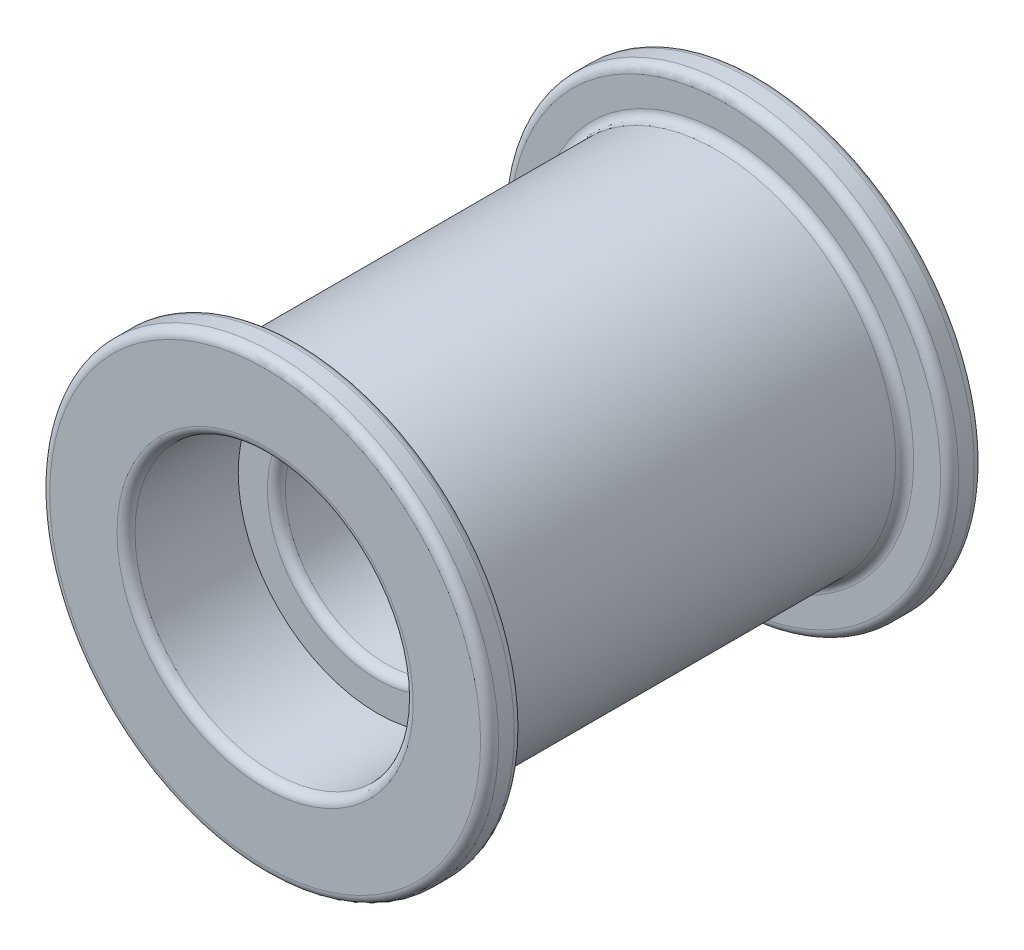
ISO-10303-21;
HEADER;
FILE_DESCRIPTION(('STEP AP214'),'2;1');
FILE_NAME('part.step','',(''),(''),'','','');
FILE_SCHEMA(('AUTOMOTIVE_DESIGN { 1 0 10303 214 1 1 1 1 }'));
ENDSEC;
DATA;
#1=APPLICATION_CONTEXT('core data for automotive mechanical design processes');
#2=APPLICATION_PROTOCOL_DEFINITION('international standard','automotive_design',2000,#1);
#3=PRODUCT_CONTEXT('',#1,'mechanical');
#4=PRODUCT('Part','Part','',(#3));
#5=PRODUCT_RELATED_PRODUCT_CATEGORY('part','',(#4));
#6=PRODUCT_DEFINITION_FORMATION('','',#4);
#7=PRODUCT_DEFINITION_CONTEXT('part definition',#1,'design');
#8=PRODUCT_DEFINITION('design','',#6,#7);
#9=PRODUCT_DEFINITION_SHAPE('','',#8);
#10=(LENGTH_UNIT() NAMED_UNIT(*) SI_UNIT(.MILLI.,.METRE.));
#11=(NAMED_UNIT(*) PLANE_ANGLE_UNIT() SI_UNIT($,.RADIAN.));
#12=(NAMED_UNIT(*) SI_UNIT($,.STERADIAN.) SOLID_ANGLE_UNIT());
#13=UNCERTAINTY_MEASURE_WITH_UNIT(LENGTH_MEASURE(1.E-05),#10,'distance_accuracy_value','');
#14=(GEOMETRIC_REPRESENTATION_CONTEXT(3) GLOBAL_UNCERTAINTY_ASSIGNED_CONTEXT((#13)) GLOBAL_UNIT_ASSIGNED_CONTEXT((#10,
#11,#12)) REPRESENTATION_CONTEXT('',''));
#15=CARTESIAN_POINT('',(0.,0.,0.));
#16=DIRECTION('',(0.,0.,1.));
#17=DIRECTION('',(1.,0.,0.));
#18=AXIS2_PLACEMENT_3D('',#15,#16,#17);
#19=CARTESIAN_POINT('',(17.0566896246943,83.,-11.5));
#20=DIRECTION('',(0.,0.,1.));
#21=DIRECTION('',(1.,0.,0.));
#22=AXIS2_PLACEMENT_3D('',#19,#20,#21);
#23=CYLINDRICAL_SURFACE('',#22,4.);
#24=CARTESIAN_POINT('',(17.0566896246943,83.,-10.3));
#25=DIRECTION('',(0.,0.,-1.));
#26=DIRECTION('',(-1.,0.,0.));
#27=AXIS2_PLACEMENT_3D('',#24,#25,#26);
#28=CIRCLE('',#27,4.);
#29=CARTESIAN_POINT('',(21.0566896246943,83.,-10.3));
#30=VERTEX_POINT('',#29);
#31=EDGE_CURVE('E52',#30,#30,#28,.F.);
#32=CARTESIAN_POINT('',(17.0566896246943,83.,-1.2));
#33=DIRECTION('',(0.,0.,1.));
#34=DIRECTION('',(1.,0.,0.));
#35=AXIS2_PLACEMENT_3D('',#32,#33,#34);
#36=CIRCLE('',#35,4.);
#37=CARTESIAN_POINT('',(21.0566896246943,83.,-1.2));
#38=VERTEX_POINT('',#37);
#39=EDGE_CURVE('E57',#38,#38,#36,.F.);
#40=CARTESIAN_POINT('',(21.0566896246943,83.,-10.3));
#41=CARTESIAN_POINT('',(21.0566896246943,83.,-10.2052083333333));
#42=CARTESIAN_POINT('',(21.0566896246943,83.,-10.1104166666667));
#43=CARTESIAN_POINT('',(21.0566896246943,83.,-9.92083333333333));
#44=CARTESIAN_POINT('',(21.0566896246943,83.,-9.82604166666667));
#45=CARTESIAN_POINT('',(21.0566896246943,83.,-9.63645833333333));
#46=CARTESIAN_POINT('',(21.0566896246943,83.,-9.54166666666667));
#47=CARTESIAN_POINT('',(21.0566896246943,83.,-9.35208333333333));
#48=CARTESIAN_POINT('',(21.0566896246943,83.,-9.25729166666667));
#49=CARTESIAN_POINT('',(21.0566896246943,83.,-9.06770833333333));
#50=CARTESIAN_POINT('',(21.0566896246943,83.,-8.97291666666666));
#51=CARTESIAN_POINT('',(21.0566896246943,83.,-8.78333333333333));
#52=CARTESIAN_POINT('',(21.0566896246943,83.,-8.68854166666667));
#53=CARTESIAN_POINT('',(21.0566896246943,83.,-8.49895833333333));
#54=CARTESIAN_POINT('',(21.0566896246943,83.,-8.40416666666667));
#55=CARTESIAN_POINT('',(21.0566896246943,83.,-8.21458333333333));
#56=CARTESIAN_POINT('',(21.0566896246943,83.,-8.11979166666667));
#57=CARTESIAN_POINT('',(21.0566896246943,83.,-7.93020833333333));
#58=CARTESIAN_POINT('',(21.0566896246943,83.,-7.83541666666667));
#59=CARTESIAN_POINT('',(21.0566896246943,83.,-7.64583333333333));
#60=CARTESIAN_POINT('',(21.0566896246943,83.,-7.55104166666667));
#61=CARTESIAN_POINT('',(21.0566896246943,83.,-7.36145833333333));
#62=CARTESIAN_POINT('',(21.0566896246943,83.,-7.26666666666667));
#63=CARTESIAN_POINT('',(21.0566896246943,83.,-7.07708333333333));
#64=CARTESIAN_POINT('',(21.0566896246943,83.,-6.98229166666667));
#65=CARTESIAN_POINT('',(21.0566896246943,83.,-6.79270833333333));
#66=CARTESIAN_POINT('',(21.0566896246943,83.,-6.69791666666667));
#67=CARTESIAN_POINT('',(21.0566896246943,83.,-6.50833333333333));
#68=CARTESIAN_POINT('',(21.0566896246943,83.,-6.41354166666667));
#69=CARTESIAN_POINT('',(21.0566896246943,83.,-6.22395833333333));
#70=CARTESIAN_POINT('',(21.0566896246943,83.,-6.12916666666667));
#71=CARTESIAN_POINT('',(21.0566896246943,83.,-5.93958333333333));
#72=CARTESIAN_POINT('',(21.0566896246943,83.,-5.84479166666667));
#73=CARTESIAN_POINT('',(21.0566896246943,83.,-5.65520833333333));
#74=CARTESIAN_POINT('',(21.0566896246943,83.,-5.56041666666667));
#75=CARTESIAN_POINT('',(21.0566896246943,83.,-5.37083333333333));
#76=CARTESIAN_POINT('',(21.0566896246943,83.,-5.27604166666667));
#77=CARTESIAN_POINT('',(21.0566896246943,83.,-5.08645833333333));
#78=CARTESIAN_POINT('',(21.0566896246943,83.,-4.99166666666667));
#79=CARTESIAN_POINT('',(21.0566896246943,83.,-4.80208333333333));
#80=CARTESIAN_POINT('',(21.0566896246943,83.,-4.70729166666667));
#81=CARTESIAN_POINT('',(21.0566896246943,83.,-4.51770833333333));
#82=CARTESIAN_POINT('',(21.0566896246943,83.,-4.42291666666667));
#83=CARTESIAN_POINT('',(21.0566896246943,83.,-4.23333333333333));
#84=CARTESIAN_POINT('',(21.0566896246943,83.,-4.13854166666667));
#85=CARTESIAN_POINT('',(21.0566896246943,83.,-3.94895833333333));
#86=CARTESIAN_POINT('',(21.0566896246943,83.,-3.85416666666667));
#87=CARTESIAN_POINT('',(21.0566896246943,83.,-3.66458333333333));
#88=CARTESIAN_POINT('',(21.0566896246943,83.,-3.56979166666667));
#89=CARTESIAN_POINT('',(21.0566896246943,83.,-3.38020833333333));
#90=CARTESIAN_POINT('',(21.0566896246943,83.,-3.28541666666667));
#91=CARTESIAN_POINT('',(21.0566896246943,83.,-3.09583333333333));
#92=CARTESIAN_POINT('',(21.0566896246943,83.,-3.00104166666667));
#93=CARTESIAN_POINT('',(21.0566896246943,83.,-2.81145833333333));
#94=CARTESIAN_POINT('',(21.0566896246943,83.,-2.71666666666667));
#95=CARTESIAN_POINT('',(21.0566896246943,83.,-2.52708333333333));
#96=CARTESIAN_POINT('',(21.0566896246943,83.,-2.43229166666667));
#97=CARTESIAN_POINT('',(21.0566896246943,83.,-2.24270833333333));
#98=CARTESIAN_POINT('',(21.0566896246943,83.,-2.14791666666667));
#99=CARTESIAN_POINT('',(21.0566896246943,83.,-1.95833333333333));
#100=CARTESIAN_POINT('',(21.0566896246943,83.,-1.86354166666667));
#101=CARTESIAN_POINT('',(21.0566896246943,83.,-1.67395833333333));
#102=CARTESIAN_POINT('',(21.0566896246943,83.,-1.57916666666667));
#103=CARTESIAN_POINT('',(21.0566896246943,83.,-1.38958333333333));
#104=CARTESIAN_POINT('',(21.0566896246943,83.,-1.29479166666667));
#105=CARTESIAN_POINT('',(21.0566896246943,83.,-1.2));
#106=B_SPLINE_CURVE_WITH_KNOTS('',3,(#40,#41,#42,#43,#44,#45,#46,#47,#48,#49,#50,#51,#52,#53,
#54,#55,#56,#57,#58,#59,#60,#61,#62,#63,#64,#65,#66,#67,#68,#69,#70,#71,#72,#73,#74,#75,#76,#77,
#78,#79,#80,#81,#82,#83,#84,#85,#86,#87,#88,#89,#90,#91,#92,#93,#94,#95,#96,#97,#98,#99,#100,
#101,#102,#103,#104,#105),.UNSPECIFIED.,.F.,.F.,(4,2,2,2,2,2,2,2,2,2,2,2,2,2,2,2,2,2,2,2,2,2,2,
2,2,2,2,2,2,2,2,2,4),(0.,0.284375,0.56875,0.853125,1.1375,1.421875,1.70625,1.990625,2.275,
2.559375,2.84375,3.128125,3.4125,3.696875,3.98125,4.265625,4.55,4.834375,5.11875,5.403125,
5.6875,5.971875,6.25625,6.540625,6.825,7.109375,7.39375,7.678125,7.9625,8.246875,8.53125,
8.815625,9.1),.UNSPECIFIED.);
#107=EDGE_CURVE('BSEAM39',#30,#38,#106,.T.);
#108=ORIENTED_EDGE('',*,*,#31,.T.);
#109=ORIENTED_EDGE('',*,*,#39,.T.);
#110=ORIENTED_EDGE('',*,*,#107,.T.);
#111=ORIENTED_EDGE('',*,*,#107,.F.);
#112=EDGE_LOOP('',(#108,#110,#109,#111));
#113=FACE_BOUND('',#112,.T.);
#114=ADVANCED_FACE('F39',(#113),#23,.T.);
#115=CARTESIAN_POINT('',(17.0566896246943,83.,-11.25));
#116=DIRECTION('',(0.,0.,1.));
#117=DIRECTION('',(1.,0.,0.));
#118=AXIS2_PLACEMENT_3D('',#115,#116,#117);
#119=CYLINDRICAL_SURFACE('',#118,2.25);
#120=CARTESIAN_POINT('',(17.0566896246943,83.,-8.55));
#121=DIRECTION('',(0.,0.,-1.));
#122=DIRECTION('',(-1.,0.,0.));
#123=AXIS2_PLACEMENT_3D('',#120,#121,#122);
#124=CIRCLE('',#123,2.25);
#125=CARTESIAN_POINT('',(14.8066896246943,83.,-8.55));
#126=VERTEX_POINT('',#125);
#127=EDGE_CURVE('E75',#126,#126,#124,.T.);
#128=ORIENTED_EDGE('',*,*,#127,.T.);
#129=EDGE_LOOP('',(#128));
#130=FACE_BOUND('',#129,.T.);
#131=CARTESIAN_POINT('',(17.0566896246943,83.,-2.95));
#132=DIRECTION('',(0.,0.,1.));
#133=DIRECTION('',(1.,0.,0.));
#134=AXIS2_PLACEMENT_3D('',#131,#132,#133);
#135=CIRCLE('',#134,2.25);
#136=CARTESIAN_POINT('',(19.3066896246943,83.,-2.95));
#137=VERTEX_POINT('',#136);
#138=EDGE_CURVE('E79',#137,#137,#135,.T.);
#139=ORIENTED_EDGE('',*,*,#138,.T.);
#140=EDGE_LOOP('',(#139));
#141=FACE_BOUND('',#140,.T.);
#142=ADVANCED_FACE('F154',(#130,#141),#119,.F.);
#143=CARTESIAN_POINT('',(0.,0.,-0.25));
#144=DIRECTION('',(0.,0.,1.));
#145=DIRECTION('',(1.,0.,0.));
#146=AXIS2_PLACEMENT_3D('',#143,#144,#145);
#147=PLANE('',#146);
#148=CARTESIAN_POINT('',(17.0566896246943,83.,-0.25));
#149=DIRECTION('',(0.,0.,1.));
#150=DIRECTION('',(1.,0.,0.));
#151=AXIS2_PLACEMENT_3D('',#148,#149,#150);
#152=CIRCLE('',#151,4.8);
#153=CARTESIAN_POINT('',(21.8566896246943,83.,-0.25));
#154=VERTEX_POINT('',#153);
#155=EDGE_CURVE('E87',#154,#154,#152,.T.);
#156=ORIENTED_EDGE('',*,*,#155,.T.);
#157=EDGE_LOOP('',(#156));
#158=FACE_BOUND('',#157,.T.);
#159=CARTESIAN_POINT('',(17.0566896246943,83.,-0.25));
#160=DIRECTION('',(0.,0.,1.));
#161=DIRECTION('',(1.,0.,0.));
#162=AXIS2_PLACEMENT_3D('',#159,#160,#161);
#163=CIRCLE('',#162,3.3);
#164=CARTESIAN_POINT('',(20.3566896246943,83.,-0.25));
#165=VERTEX_POINT('',#164);
#166=EDGE_CURVE('E91',#165,#165,#163,.F.);
#167=ORIENTED_EDGE('',*,*,#166,.T.);
#168=EDGE_LOOP('',(#167));
#169=FACE_BOUND('',#168,.T.);
#170=ADVANCED_FACE('F160',(#158,#169),#147,.T.);
#171=CARTESIAN_POINT('',(17.0566896246943,83.,-11.25));
#172=DIRECTION('',(0.,0.,-1.));
#173=DIRECTION('',(-1.,0.,0.));
#174=AXIS2_PLACEMENT_3D('',#171,#172,#173);
#175=PLANE('',#174);
#176=CARTESIAN_POINT('',(17.0566896246943,83.,-11.25));
#177=DIRECTION('',(0.,0.,-1.));
#178=DIRECTION('',(-1.,0.,0.));
#179=AXIS2_PLACEMENT_3D('',#176,#177,#178);
#180=CIRCLE('',#179,4.8);
#181=CARTESIAN_POINT('',(12.2566896246943,83.,-11.25));
#182=VERTEX_POINT('',#181);
#183=EDGE_CURVE('E107',#182,#182,#180,.T.);
#184=ORIENTED_EDGE('',*,*,#183,.T.);
#185=EDGE_LOOP('',(#184));
#186=FACE_BOUND('',#185,.T.);
#187=CARTESIAN_POINT('',(17.0566896246943,83.,-11.25));
#188=DIRECTION('',(0.,0.,-1.));
#189=DIRECTION('',(-1.,0.,0.));
#190=AXIS2_PLACEMENT_3D('',#187,#188,#189);
#191=CIRCLE('',#190,3.3);
#192=CARTESIAN_POINT('',(13.7566896246943,83.,-11.25));
#193=VERTEX_POINT('',#192);
#194=EDGE_CURVE('E111',#193,#193,#191,.F.);
#195=ORIENTED_EDGE('',*,*,#194,.T.);
#196=EDGE_LOOP('',(#195));
#197=FACE_BOUND('',#196,.T.);
#198=ADVANCED_FACE('F332',(#186,#197),#175,.T.);
#199=CARTESIAN_POINT('',(17.0566896246943,83.,-2.75));
#200=DIRECTION('',(0.,0.,1.));
#201=DIRECTION('',(1.,0.,0.));
#202=AXIS2_PLACEMENT_3D('',#199,#200,#201);
#203=CYLINDRICAL_SURFACE('',#202,3.1);
#204=CARTESIAN_POINT('',(17.0566896246943,83.,-0.45));
#205=DIRECTION('',(0.,0.,1.));
#206=DIRECTION('',(1.,0.,0.));
#207=AXIS2_PLACEMENT_3D('',#204,#205,#206);
#208=CIRCLE('',#207,3.1);
#209=CARTESIAN_POINT('',(20.1566896246943,83.,-0.45));
#210=VERTEX_POINT('',#209);
#211=EDGE_CURVE('E63',#210,#210,#208,.T.);
#212=ORIENTED_EDGE('',*,*,#211,.T.);
#213=EDGE_LOOP('',(#212));
#214=FACE_BOUND('',#213,.T.);
#215=CARTESIAN_POINT('',(17.0566896246943,83.,-2.75));
#216=DIRECTION('',(0.,0.,1.));
#217=DIRECTION('',(1.,0.,0.));
#218=AXIS2_PLACEMENT_3D('',#215,#216,#217);
#219=CIRCLE('',#218,3.1);
#220=CARTESIAN_POINT('',(20.1566896246943,83.,-2.75));
#221=VERTEX_POINT('',#220);
#222=EDGE_CURVE('E127',#221,#221,#219,.T.);
#223=ORIENTED_EDGE('',*,*,#222,.F.);
#224=EDGE_LOOP('',(#223));
#225=FACE_BOUND('',#224,.T.);
#226=ADVANCED_FACE('F322',(#214,#225),#203,.F.);
#227=CARTESIAN_POINT('',(0.,0.,-2.75));
#228=DIRECTION('',(0.,0.,1.));
#229=DIRECTION('',(1.,0.,0.));
#230=AXIS2_PLACEMENT_3D('',#227,#228,#229);
#231=PLANE('',#230);
#232=CARTESIAN_POINT('',(17.0566896246943,83.,-2.75));
#233=DIRECTION('',(0.,0.,1.));
#234=DIRECTION('',(1.,0.,0.));
#235=AXIS2_PLACEMENT_3D('',#232,#233,#234);
#236=CIRCLE('',#235,2.45);
#237=CARTESIAN_POINT('',(19.5066896246943,83.,-2.75));
#238=VERTEX_POINT('',#237);
#239=EDGE_CURVE('E67',#238,#238,#236,.F.);
#240=ORIENTED_EDGE('',*,*,#239,.T.);
#241=EDGE_LOOP('',(#240));
#242=FACE_BOUND('',#241,.T.);
#243=ORIENTED_EDGE('',*,*,#222,.T.);
#244=EDGE_LOOP('',(#243));
#245=FACE_BOUND('',#244,.T.);
#246=ADVANCED_FACE('F311',(#242,#245),#231,.T.);
#247=CARTESIAN_POINT('',(17.0566896246943,83.,-1.));
#248=DIRECTION('',(0.,0.,1.));
#249=DIRECTION('',(1.,0.,0.));
#250=AXIS2_PLACEMENT_3D('',#247,#248,#249);
#251=CYLINDRICAL_SURFACE('',#250,5.);
#252=CARTESIAN_POINT('',(17.0566896246943,83.,-0.8));
#253=DIRECTION('',(0.,0.,1.));
#254=DIRECTION('',(1.,0.,0.));
#255=AXIS2_PLACEMENT_3D('',#252,#253,#254);
#256=CIRCLE('',#255,5.);
#257=CARTESIAN_POINT('',(22.0566896246943,83.,-0.8));
#258=VERTEX_POINT('',#257);
#259=EDGE_CURVE('E99',#258,#258,#256,.T.);
#260=ORIENTED_EDGE('',*,*,#259,.T.);
#261=EDGE_LOOP('',(#260));
#262=FACE_BOUND('',#261,.T.);
#263=CARTESIAN_POINT('',(17.0566896246943,83.,-0.45));
#264=DIRECTION('',(0.,0.,1.));
#265=DIRECTION('',(1.,0.,0.));
#266=AXIS2_PLACEMENT_3D('',#263,#264,#265);
#267=CIRCLE('',#266,5.);
#268=CARTESIAN_POINT('',(22.0566896246943,83.,-0.45));
#269=VERTEX_POINT('',#268);
#270=EDGE_CURVE('E103',#269,#269,#267,.F.);
#271=ORIENTED_EDGE('',*,*,#270,.T.);
#272=EDGE_LOOP('',(#271));
#273=FACE_BOUND('',#272,.T.);
#274=ADVANCED_FACE('F150',(#262,#273),#251,.T.);
#275=CARTESIAN_POINT('',(17.0566896246943,83.,-1.));
#276=DIRECTION('',(0.,0.,1.));
#277=DIRECTION('',(1.,0.,0.));
#278=AXIS2_PLACEMENT_3D('',#275,#276,#277);
#279=PLANE('',#278);
#280=CARTESIAN_POINT('',(17.0566896246943,83.,-1.));
#281=DIRECTION('',(0.,0.,1.));
#282=DIRECTION('',(1.,0.,0.));
#283=AXIS2_PLACEMENT_3D('',#280,#281,#282);
#284=CIRCLE('',#283,4.2);
#285=CARTESIAN_POINT('',(21.2566896246943,83.,-1.));
#286=VERTEX_POINT('',#285);
#287=EDGE_CURVE('E10',#286,#286,#284,.T.);
#288=ORIENTED_EDGE('',*,*,#287,.T.);
#289=EDGE_LOOP('',(#288));
#290=FACE_BOUND('',#289,.T.);
#291=CARTESIAN_POINT('',(17.0566896246943,83.,-1.));
#292=DIRECTION('',(0.,0.,1.));
#293=DIRECTION('',(1.,0.,0.));
#294=AXIS2_PLACEMENT_3D('',#291,#292,#293);
#295=CIRCLE('',#294,4.8);
#296=CARTESIAN_POINT('',(21.8566896246943,83.,-1.));
#297=VERTEX_POINT('',#296);
#298=EDGE_CURVE('E95',#297,#297,#295,.F.);
#299=ORIENTED_EDGE('',*,*,#298,.T.);
#300=EDGE_LOOP('',(#299));
#301=FACE_BOUND('',#300,.T.);
#302=ADVANCED_FACE('F140',(#290,#301),#279,.F.);
#303=CARTESIAN_POINT('',(0.,0.,-8.75));
#304=DIRECTION('',(0.,0.,-1.));
#305=DIRECTION('',(1.,0.,0.));
#306=AXIS2_PLACEMENT_3D('',#303,#304,#305);
#307=PLANE('',#306);
#308=CARTESIAN_POINT('',(17.0566896246943,83.,-8.75));
#309=DIRECTION('',(0.,0.,-1.));
#310=DIRECTION('',(-1.,0.,0.));
#311=AXIS2_PLACEMENT_3D('',#308,#309,#310);
#312=CIRCLE('',#311,2.45);
#313=CARTESIAN_POINT('',(14.6066896246943,83.,-8.75));
#314=VERTEX_POINT('',#313);
#315=EDGE_CURVE('E83',#314,#314,#312,.F.);
#316=ORIENTED_EDGE('',*,*,#315,.T.);
#317=EDGE_LOOP('',(#316));
#318=FACE_BOUND('',#317,.T.);
#319=CARTESIAN_POINT('',(17.0566896246943,83.,-8.75));
#320=DIRECTION('',(0.,0.,1.));
#321=DIRECTION('',(1.,0.,0.));
#322=AXIS2_PLACEMENT_3D('',#319,#320,#321);
#323=CIRCLE('',#322,3.1);
#324=CARTESIAN_POINT('',(20.1566896246943,83.,-8.75));
#325=VERTEX_POINT('',#324);
#326=EDGE_CURVE('E131',#325,#325,#323,.T.);
#327=ORIENTED_EDGE('',*,*,#326,.F.);
#328=EDGE_LOOP('',(#327));
#329=FACE_BOUND('',#328,.T.);
#330=ADVANCED_FACE('F138',(#318,#329),#307,.T.);
#331=CARTESIAN_POINT('',(17.0566896246943,83.,-8.75));
#332=DIRECTION('',(0.,0.,-1.));
#333=DIRECTION('',(-1.,0.,0.));
#334=AXIS2_PLACEMENT_3D('',#331,#332,#333);
#335=CYLINDRICAL_SURFACE('',#334,3.1);
#336=CARTESIAN_POINT('',(17.0566896246943,83.,-11.05));
#337=DIRECTION('',(0.,0.,-1.));
#338=DIRECTION('',(-1.,0.,0.));
#339=AXIS2_PLACEMENT_3D('',#336,#337,#338);
#340=CIRCLE('',#339,3.1);
#341=CARTESIAN_POINT('',(13.9566896246943,83.,-11.05));
#342=VERTEX_POINT('',#341);
#343=EDGE_CURVE('E71',#342,#342,#340,.T.);
#344=ORIENTED_EDGE('',*,*,#343,.T.);
#345=EDGE_LOOP('',(#344));
#346=FACE_BOUND('',#345,.T.);
#347=ORIENTED_EDGE('',*,*,#326,.T.);
#348=EDGE_LOOP('',(#347));
#349=FACE_BOUND('',#348,.T.);
#350=ADVANCED_FACE('F136',(#346,#349),#335,.F.);
#351=CARTESIAN_POINT('',(17.0566896246943,83.,-10.5));
#352=DIRECTION('',(0.,0.,-1.));
#353=DIRECTION('',(1.,0.,0.));
#354=AXIS2_PLACEMENT_3D('',#351,#352,#353);
#355=PLANE('',#354);
#356=CARTESIAN_POINT('',(17.0566896246943,83.,-10.5));
#357=DIRECTION('',(0.,0.,-1.));
#358=DIRECTION('',(-1.,0.,0.));
#359=AXIS2_PLACEMENT_3D('',#356,#357,#358);
#360=CIRCLE('',#359,4.2);
#361=CARTESIAN_POINT('',(12.8566896246943,83.,-10.5));
#362=VERTEX_POINT('',#361);
#363=EDGE_CURVE('E47',#362,#362,#360,.T.);
#364=ORIENTED_EDGE('',*,*,#363,.T.);
#365=EDGE_LOOP('',(#364));
#366=FACE_BOUND('',#365,.T.);
#367=CARTESIAN_POINT('',(17.0566896246943,83.,-10.5));
#368=DIRECTION('',(0.,0.,-1.));
#369=DIRECTION('',(-1.,0.,0.));
#370=AXIS2_PLACEMENT_3D('',#367,#368,#369);
#371=CIRCLE('',#370,4.8);
#372=CARTESIAN_POINT('',(12.2566896246943,83.,-10.5));
#373=VERTEX_POINT('',#372);
#374=EDGE_CURVE('E123',#373,#373,#371,.F.);
#375=ORIENTED_EDGE('',*,*,#374,.T.);
#376=EDGE_LOOP('',(#375));
#377=FACE_BOUND('',#376,.T.);
#378=ADVANCED_FACE('F147',(#366,#377),#355,.F.);
#379=CARTESIAN_POINT('',(17.0566896246943,83.,-10.5));
#380=DIRECTION('',(0.,0.,-1.));
#381=DIRECTION('',(-1.,0.,0.));
#382=AXIS2_PLACEMENT_3D('',#379,#380,#381);
#383=CYLINDRICAL_SURFACE('',#382,5.);
#384=CARTESIAN_POINT('',(17.0566896246943,83.,-10.7));
#385=DIRECTION('',(0.,0.,-1.));
#386=DIRECTION('',(-1.,0.,0.));
#387=AXIS2_PLACEMENT_3D('',#384,#385,#386);
#388=CIRCLE('',#387,5.);
#389=CARTESIAN_POINT('',(12.0566896246943,83.,-10.7));
#390=VERTEX_POINT('',#389);
#391=EDGE_CURVE('E115',#390,#390,#388,.T.);
#392=ORIENTED_EDGE('',*,*,#391,.T.);
#393=EDGE_LOOP('',(#392));
#394=FACE_BOUND('',#393,.T.);
#395=CARTESIAN_POINT('',(17.0566896246943,83.,-11.05));
#396=DIRECTION('',(0.,0.,-1.));
#397=DIRECTION('',(-1.,0.,0.));
#398=AXIS2_PLACEMENT_3D('',#395,#396,#397);
#399=CIRCLE('',#398,5.);
#400=CARTESIAN_POINT('',(12.0566896246943,83.,-11.05));
#401=VERTEX_POINT('',#400);
#402=EDGE_CURVE('E119',#401,#401,#399,.F.);
#403=ORIENTED_EDGE('',*,*,#402,.T.);
#404=EDGE_LOOP('',(#403));
#405=FACE_BOUND('',#404,.T.);
#406=ADVANCED_FACE('F171',(#394,#405),#383,.T.);
#407=CARTESIAN_POINT('',(17.0566896246943,83.,-10.7));
#408=DIRECTION('',(0.,0.,-1.));
#409=DIRECTION('',(-1.,0.,0.));
#410=AXIS2_PLACEMENT_3D('',#407,#408,#409);
#411=TOROIDAL_SURFACE('',#410,4.8,0.2);
#412=ORIENTED_EDGE('',*,*,#391,.F.);
#413=EDGE_LOOP('',(#412));
#414=FACE_BOUND('',#413,.T.);
#415=ORIENTED_EDGE('',*,*,#374,.F.);
#416=EDGE_LOOP('',(#415));
#417=FACE_BOUND('',#416,.T.);
#418=ADVANCED_FACE('F167',(#414,#417),#411,.T.);
#419=CARTESIAN_POINT('',(17.0566896246943,83.,-11.05));
#420=DIRECTION('',(0.,0.,-1.));
#421=DIRECTION('',(-1.,0.,0.));
#422=AXIS2_PLACEMENT_3D('',#419,#420,#421);
#423=TOROIDAL_SURFACE('',#422,4.8,0.2);
#424=ORIENTED_EDGE('',*,*,#183,.F.);
#425=EDGE_LOOP('',(#424));
#426=FACE_BOUND('',#425,.T.);
#427=ORIENTED_EDGE('',*,*,#402,.F.);
#428=EDGE_LOOP('',(#427));
#429=FACE_BOUND('',#428,.T.);
#430=ADVANCED_FACE('F170',(#426,#429),#423,.T.);
#431=CARTESIAN_POINT('',(17.0566896246943,83.,-0.8));
#432=DIRECTION('',(0.,0.,1.));
#433=DIRECTION('',(1.,0.,0.));
#434=AXIS2_PLACEMENT_3D('',#431,#432,#433);
#435=TOROIDAL_SURFACE('',#434,4.8,0.2);
#436=ORIENTED_EDGE('',*,*,#298,.F.);
#437=EDGE_LOOP('',(#436));
#438=FACE_BOUND('',#437,.T.);
#439=ORIENTED_EDGE('',*,*,#259,.F.);
#440=EDGE_LOOP('',(#439));
#441=FACE_BOUND('',#440,.T.);
#442=ADVANCED_FACE('F175',(#438,#441),#435,.T.);
#443=CARTESIAN_POINT('',(17.0566896246943,83.,-0.45));
#444=DIRECTION('',(0.,0.,1.));
#445=DIRECTION('',(1.,0.,0.));
#446=AXIS2_PLACEMENT_3D('',#443,#444,#445);
#447=TOROIDAL_SURFACE('',#446,4.8,0.2);
#448=ORIENTED_EDGE('',*,*,#270,.F.);
#449=EDGE_LOOP('',(#448));
#450=FACE_BOUND('',#449,.T.);
#451=ORIENTED_EDGE('',*,*,#155,.F.);
#452=EDGE_LOOP('',(#451));
#453=FACE_BOUND('',#452,.T.);
#454=ADVANCED_FACE('F179',(#450,#453),#447,.T.);
#455=CARTESIAN_POINT('',(17.0566896246943,83.,-8.55));
#456=DIRECTION('',(0.,0.,-1.));
#457=DIRECTION('',(-1.,0.,0.));
#458=AXIS2_PLACEMENT_3D('',#455,#456,#457);
#459=TOROIDAL_SURFACE('',#458,2.45,0.2);
#460=ORIENTED_EDGE('',*,*,#127,.F.);
#461=EDGE_LOOP('',(#460));
#462=FACE_BOUND('',#461,.T.);
#463=ORIENTED_EDGE('',*,*,#315,.F.);
#464=EDGE_LOOP('',(#463));
#465=FACE_BOUND('',#464,.T.);
#466=ADVANCED_FACE('F183',(#462,#465),#459,.T.);
#467=CARTESIAN_POINT('',(17.0566896246943,83.,-11.05));
#468=DIRECTION('',(0.,0.,-1.));
#469=DIRECTION('',(-1.,0.,0.));
#470=AXIS2_PLACEMENT_3D('',#467,#468,#469);
#471=TOROIDAL_SURFACE('',#470,3.3,0.2);
#472=ORIENTED_EDGE('',*,*,#343,.F.);
#473=EDGE_LOOP('',(#472));
#474=FACE_BOUND('',#473,.T.);
#475=ORIENTED_EDGE('',*,*,#194,.F.);
#476=EDGE_LOOP('',(#475));
#477=FACE_BOUND('',#476,.T.);
#478=ADVANCED_FACE('F187',(#474,#477),#471,.T.);
#479=CARTESIAN_POINT('',(17.0566896246943,83.,-2.95));
#480=DIRECTION('',(0.,0.,1.));
#481=DIRECTION('',(1.,0.,0.));
#482=AXIS2_PLACEMENT_3D('',#479,#480,#481);
#483=TOROIDAL_SURFACE('',#482,2.45,0.2);
#484=ORIENTED_EDGE('',*,*,#239,.F.);
#485=EDGE_LOOP('',(#484));
#486=FACE_BOUND('',#485,.T.);
#487=ORIENTED_EDGE('',*,*,#138,.F.);
#488=EDGE_LOOP('',(#487));
#489=FACE_BOUND('',#488,.T.);
#490=ADVANCED_FACE('F191',(#486,#489),#483,.T.);
#491=CARTESIAN_POINT('',(17.0566896246943,83.,-0.45));
#492=DIRECTION('',(0.,0.,1.));
#493=DIRECTION('',(1.,0.,0.));
#494=AXIS2_PLACEMENT_3D('',#491,#492,#493);
#495=TOROIDAL_SURFACE('',#494,3.3,0.2);
#496=ORIENTED_EDGE('',*,*,#166,.F.);
#497=EDGE_LOOP('',(#496));
#498=FACE_BOUND('',#497,.T.);
#499=ORIENTED_EDGE('',*,*,#211,.F.);
#500=EDGE_LOOP('',(#499));
#501=FACE_BOUND('',#500,.T.);
#502=ADVANCED_FACE('F195',(#498,#501),#495,.T.);
#503=CARTESIAN_POINT('',(17.0566896246943,83.,-10.3));
#504=DIRECTION('',(0.,0.,-1.));
#505=DIRECTION('',(-1.,0.,0.));
#506=AXIS2_PLACEMENT_3D('',#503,#504,#505);
#507=TOROIDAL_SURFACE('',#506,4.2,0.2);
#508=ORIENTED_EDGE('',*,*,#363,.F.);
#509=EDGE_LOOP('',(#508));
#510=FACE_BOUND('',#509,.T.);
#511=ORIENTED_EDGE('',*,*,#31,.F.);
#512=EDGE_LOOP('',(#511));
#513=FACE_BOUND('',#512,.T.);
#514=ADVANCED_FACE('F198',(#510,#513),#507,.F.);
#515=CARTESIAN_POINT('',(17.0566896246943,83.,-1.2));
#516=DIRECTION('',(0.,0.,1.));
#517=DIRECTION('',(1.,0.,0.));
#518=AXIS2_PLACEMENT_3D('',#515,#516,#517);
#519=TOROIDAL_SURFACE('',#518,4.2,0.2);
#520=ORIENTED_EDGE('',*,*,#39,.F.);
#521=EDGE_LOOP('',(#520));
#522=FACE_BOUND('',#521,.T.);
#523=ORIENTED_EDGE('',*,*,#287,.F.);
#524=EDGE_LOOP('',(#523));
#525=FACE_BOUND('',#524,.T.);
#526=ADVANCED_FACE('F41',(#522,#525),#519,.F.);
#527=CLOSED_SHELL('',(#114,#142,#170,#198,#226,#246,#274,#302,#330,#350,#378,#406,#418,#430,
#442,#454,#466,#478,#490,#502,#514,#526));
#528=MANIFOLD_SOLID_BREP('B2',#527);
#529=ADVANCED_BREP_SHAPE_REPRESENTATION('',(#18,#528),#14);
#530=SHAPE_DEFINITION_REPRESENTATION(#9,#529);
ENDSEC;
END-ISO-10303-21;
